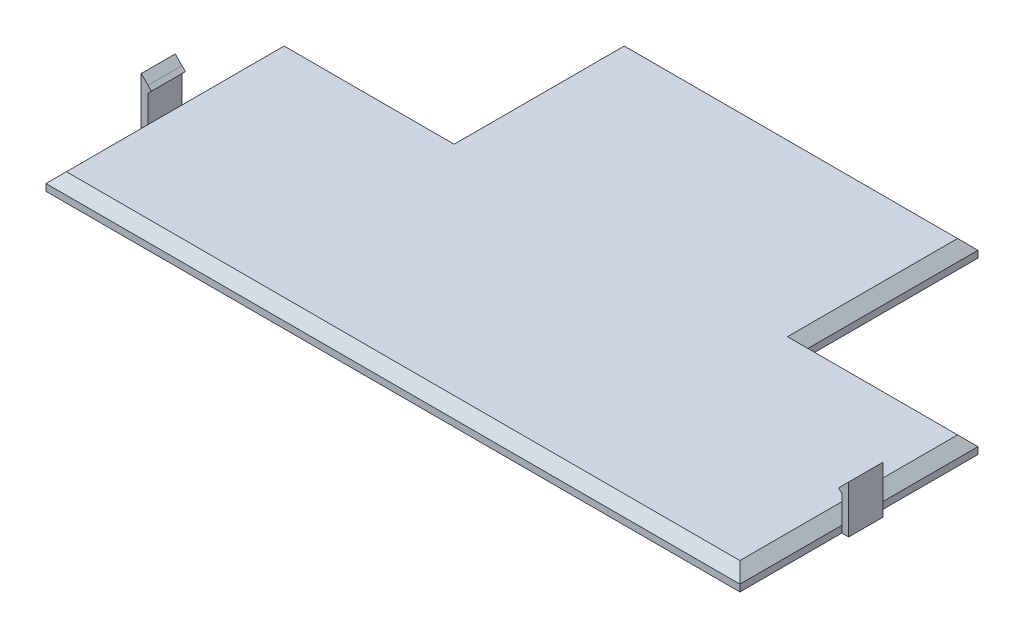
ISO-10303-21;
HEADER;
FILE_DESCRIPTION(('STEP AP214'),'2;1');
FILE_NAME('part.step','',(''),(''),'','','');
FILE_SCHEMA(('AUTOMOTIVE_DESIGN { 1 0 10303 214 1 1 1 1 }'));
ENDSEC;
DATA;
#1=APPLICATION_CONTEXT('core data for automotive mechanical design processes');
#2=APPLICATION_PROTOCOL_DEFINITION('international standard','automotive_design',2000,#1);
#3=PRODUCT_CONTEXT('',#1,'mechanical');
#4=PRODUCT('Part','Part','',(#3));
#5=PRODUCT_RELATED_PRODUCT_CATEGORY('part','',(#4));
#6=PRODUCT_DEFINITION_FORMATION('','',#4);
#7=PRODUCT_DEFINITION_CONTEXT('part definition',#1,'design');
#8=PRODUCT_DEFINITION('design','',#6,#7);
#9=PRODUCT_DEFINITION_SHAPE('','',#8);
#10=(LENGTH_UNIT() NAMED_UNIT(*) SI_UNIT(.MILLI.,.METRE.));
#11=(NAMED_UNIT(*) PLANE_ANGLE_UNIT() SI_UNIT($,.RADIAN.));
#12=(NAMED_UNIT(*) SI_UNIT($,.STERADIAN.) SOLID_ANGLE_UNIT());
#13=UNCERTAINTY_MEASURE_WITH_UNIT(LENGTH_MEASURE(1.E-05),#10,'distance_accuracy_value','');
#14=(GEOMETRIC_REPRESENTATION_CONTEXT(3) GLOBAL_UNCERTAINTY_ASSIGNED_CONTEXT((#13)) GLOBAL_UNIT_ASSIGNED_CONTEXT((#10,
#11,#12)) REPRESENTATION_CONTEXT('',''));
#15=CARTESIAN_POINT('',(0.,0.,0.));
#16=DIRECTION('',(0.,0.,1.));
#17=DIRECTION('',(1.,0.,0.));
#18=AXIS2_PLACEMENT_3D('',#15,#16,#17);
#19=CARTESIAN_POINT('',(-96.8055555555555,14.,3.47222222222221));
#20=DIRECTION('',(-1.,0.,0.));
#21=DIRECTION('',(0.,0.,1.));
#22=AXIS2_PLACEMENT_3D('',#19,#20,#21);
#23=PLANE('',#22);
#24=DIRECTION('',(0.,0.,-1.));
#25=VECTOR('',#24,1.);
#26=CARTESIAN_POINT('',(-96.8055555555555,9.99999999999997,13.4722222222222));
#27=LINE('',#26,#25);
#28=CARTESIAN_POINT('',(-96.8055555555555,9.99999999999997,13.4722222222222));
#29=VERTEX_POINT('',#28);
#30=CARTESIAN_POINT('',(-96.8055555555555,9.99999999999997,3.47222222222221));
#31=VERTEX_POINT('',#30);
#32=EDGE_CURVE('E261',#29,#31,#27,.T.);
#33=ORIENTED_EDGE('',*,*,#32,.F.);
#34=DIRECTION('',(0.,-1.,0.));
#35=VECTOR('',#34,1.);
#36=CARTESIAN_POINT('',(-96.8055555555555,14.,13.4722222222222));
#37=LINE('',#36,#35);
#38=CARTESIAN_POINT('',(-96.8055555555555,2.,13.4722222222222));
#39=VERTEX_POINT('',#38);
#40=EDGE_CURVE('E266',#29,#39,#37,.T.);
#41=ORIENTED_EDGE('',*,*,#40,.T.);
#42=DIRECTION('',(0.,0.,-1.));
#43=VECTOR('',#42,1.);
#44=CARTESIAN_POINT('',(-96.8055555555555,2.,3.47222222222221));
#45=LINE('',#44,#43);
#46=CARTESIAN_POINT('',(-96.8055555555555,2.,3.47222222222221));
#47=VERTEX_POINT('',#46);
#48=EDGE_CURVE('E263',#39,#47,#45,.T.);
#49=ORIENTED_EDGE('',*,*,#48,.T.);
#50=DIRECTION('',(0.,-1.,0.));
#51=VECTOR('',#50,1.);
#52=CARTESIAN_POINT('',(-96.8055555555555,14.,3.47222222222221));
#53=LINE('',#52,#51);
#54=EDGE_CURVE('E255',#31,#47,#53,.T.);
#55=ORIENTED_EDGE('',*,*,#54,.F.);
#56=EDGE_LOOP('',(#33,#41,#49,#55));
#57=FACE_BOUND('',#56,.T.);
#58=ADVANCED_FACE('F49',(#57),#23,.F.);
#59=CARTESIAN_POINT('',(-96.8055555555555,5.,43.4722222222222));
#60=DIRECTION('',(1.,0.,0.));
#61=DIRECTION('',(0.,0.,-1.));
#62=AXIS2_PLACEMENT_3D('',#59,#60,#61);
#63=PLANE('',#62);
#64=DIRECTION('',(0.,-1.,0.));
#65=VECTOR('',#64,1.);
#66=CARTESIAN_POINT('',(-96.8055555555555,2.,3.47222222222221));
#67=LINE('',#66,#65);
#68=CARTESIAN_POINT('',(-96.8055555555555,0.,3.47222222222221));
#69=VERTEX_POINT('',#68);
#70=EDGE_CURVE('E277',#47,#69,#67,.T.);
#71=ORIENTED_EDGE('',*,*,#70,.F.);
#72=DIRECTION('',(0.,0.,-1.));
#73=VECTOR('',#72,1.);
#74=CARTESIAN_POINT('',(-96.8055555555555,2.,43.4722222222222));
#75=LINE('',#74,#73);
#76=CARTESIAN_POINT('',(-96.8055555555555,2.,-26.5277777777778));
#77=VERTEX_POINT('',#76);
#78=EDGE_CURVE('E438',#47,#77,#75,.T.);
#79=ORIENTED_EDGE('',*,*,#78,.T.);
#80=DIRECTION('',(0.,-1.,0.));
#81=VECTOR('',#80,1.);
#82=CARTESIAN_POINT('',(-96.8055555555555,5.,-26.5277777777778));
#83=LINE('',#82,#81);
#84=CARTESIAN_POINT('',(-96.8055555555555,0.,-26.5277777777778));
#85=VERTEX_POINT('',#84);
#86=EDGE_CURVE('E383',#77,#85,#83,.T.);
#87=ORIENTED_EDGE('',*,*,#86,.T.);
#88=DIRECTION('',(0.,0.,1.));
#89=VECTOR('',#88,1.);
#90=CARTESIAN_POINT('',(-96.8055555555555,0.,43.4722222222222));
#91=LINE('',#90,#89);
#92=EDGE_CURVE('E351',#85,#69,#91,.T.);
#93=ORIENTED_EDGE('',*,*,#92,.T.);
#94=EDGE_LOOP('',(#71,#79,#87,#93));
#95=FACE_BOUND('',#94,.T.);
#96=ADVANCED_FACE('F588',(#95),#63,.F.);
#97=DIRECTION('',(0.,1.,0.));
#98=VECTOR('',#97,1.);
#99=CARTESIAN_POINT('',(-96.8055555555555,2.,13.4722222222222));
#100=LINE('',#99,#98);
#101=CARTESIAN_POINT('',(-96.8055555555555,0.,13.4722222222222));
#102=VERTEX_POINT('',#101);
#103=EDGE_CURVE('E291',#102,#39,#100,.T.);
#104=ORIENTED_EDGE('',*,*,#103,.F.);
#105=CARTESIAN_POINT('',(-96.8055555555555,0.,43.4722222222222));
#106=VERTEX_POINT('',#105);
#107=EDGE_CURVE('E355',#102,#106,#91,.T.);
#108=ORIENTED_EDGE('',*,*,#107,.T.);
#109=DIRECTION('',(0.,-1.,0.));
#110=VECTOR('',#109,1.);
#111=CARTESIAN_POINT('',(-96.8055555555555,5.,43.4722222222222));
#112=LINE('',#111,#110);
#113=CARTESIAN_POINT('',(-96.8055555555555,2.,43.4722222222222));
#114=VERTEX_POINT('',#113);
#115=EDGE_CURVE('E405',#114,#106,#112,.T.);
#116=ORIENTED_EDGE('',*,*,#115,.F.);
#117=EDGE_CURVE('E439',#114,#39,#75,.T.);
#118=ORIENTED_EDGE('',*,*,#117,.T.);
#119=EDGE_LOOP('',(#104,#108,#116,#118));
#120=FACE_BOUND('',#119,.T.);
#121=ADVANCED_FACE('F550',(#120),#63,.F.);
#122=CARTESIAN_POINT('',(107.194444444444,14.,3.47222222222221));
#123=DIRECTION('',(1.,0.,0.));
#124=DIRECTION('',(0.,0.,-1.));
#125=AXIS2_PLACEMENT_3D('',#122,#123,#124);
#126=PLANE('',#125);
#127=DIRECTION('',(0.,0.,1.));
#128=VECTOR('',#127,1.);
#129=CARTESIAN_POINT('',(107.194444444444,9.99999999999999,3.47222222222221));
#130=LINE('',#129,#128);
#131=CARTESIAN_POINT('',(107.194444444444,9.99999999999999,3.47222222222221));
#132=VERTEX_POINT('',#131);
#133=CARTESIAN_POINT('',(107.194444444444,9.99999999999999,13.4722222222222));
#134=VERTEX_POINT('',#133);
#135=EDGE_CURVE('E305',#132,#134,#130,.T.);
#136=ORIENTED_EDGE('',*,*,#135,.F.);
#137=DIRECTION('',(0.,-1.,0.));
#138=VECTOR('',#137,1.);
#139=CARTESIAN_POINT('',(107.194444444444,14.,3.47222222222221));
#140=LINE('',#139,#138);
#141=CARTESIAN_POINT('',(107.194444444444,2.,3.47222222222221));
#142=VERTEX_POINT('',#141);
#143=EDGE_CURVE('E313',#132,#142,#140,.T.);
#144=ORIENTED_EDGE('',*,*,#143,.T.);
#145=DIRECTION('',(0.,0.,1.));
#146=VECTOR('',#145,1.);
#147=CARTESIAN_POINT('',(107.194444444444,2.,13.4722222222222));
#148=LINE('',#147,#146);
#149=CARTESIAN_POINT('',(107.194444444444,2.,13.4722222222222));
#150=VERTEX_POINT('',#149);
#151=EDGE_CURVE('E325',#142,#150,#148,.T.);
#152=ORIENTED_EDGE('',*,*,#151,.T.);
#153=DIRECTION('',(0.,-1.,0.));
#154=VECTOR('',#153,1.);
#155=CARTESIAN_POINT('',(107.194444444444,14.,13.4722222222222));
#156=LINE('',#155,#154);
#157=EDGE_CURVE('E316',#134,#150,#156,.T.);
#158=ORIENTED_EDGE('',*,*,#157,.F.);
#159=EDGE_LOOP('',(#136,#144,#152,#158));
#160=FACE_BOUND('',#159,.T.);
#161=ADVANCED_FACE('F619',(#160),#126,.F.);
#162=CARTESIAN_POINT('',(107.194444444444,5.,-26.5277777777778));
#163=DIRECTION('',(-1.,0.,0.));
#164=DIRECTION('',(0.,0.,1.));
#165=AXIS2_PLACEMENT_3D('',#162,#163,#164);
#166=PLANE('',#165);
#167=DIRECTION('',(0.,-1.,0.));
#168=VECTOR('',#167,1.);
#169=CARTESIAN_POINT('',(107.194444444444,2.,13.4722222222222));
#170=LINE('',#169,#168);
#171=CARTESIAN_POINT('',(107.194444444444,0.,13.4722222222222));
#172=VERTEX_POINT('',#171);
#173=EDGE_CURVE('E319',#150,#172,#170,.T.);
#174=ORIENTED_EDGE('',*,*,#173,.F.);
#175=DIRECTION('',(0.,0.,1.));
#176=VECTOR('',#175,1.);
#177=CARTESIAN_POINT('',(107.194444444444,2.,-26.5277777777778));
#178=LINE('',#177,#176);
#179=CARTESIAN_POINT('',(107.194444444444,2.,43.4722222222222));
#180=VERTEX_POINT('',#179);
#181=EDGE_CURVE('E458',#150,#180,#178,.T.);
#182=ORIENTED_EDGE('',*,*,#181,.T.);
#183=DIRECTION('',(0.,-1.,0.));
#184=VECTOR('',#183,1.);
#185=CARTESIAN_POINT('',(107.194444444444,5.,43.4722222222222));
#186=LINE('',#185,#184);
#187=CARTESIAN_POINT('',(107.194444444444,0.,43.4722222222222));
#188=VERTEX_POINT('',#187);
#189=EDGE_CURVE('E402',#180,#188,#186,.T.);
#190=ORIENTED_EDGE('',*,*,#189,.T.);
#191=DIRECTION('',(0.,0.,-1.));
#192=VECTOR('',#191,1.);
#193=CARTESIAN_POINT('',(107.194444444444,0.,-26.5277777777778));
#194=LINE('',#193,#192);
#195=EDGE_CURVE('E360',#188,#172,#194,.T.);
#196=ORIENTED_EDGE('',*,*,#195,.T.);
#197=EDGE_LOOP('',(#174,#182,#190,#196));
#198=FACE_BOUND('',#197,.T.);
#199=ADVANCED_FACE('F560',(#198),#166,.F.);
#200=DIRECTION('',(0.,1.,0.));
#201=VECTOR('',#200,1.);
#202=CARTESIAN_POINT('',(107.194444444444,2.,3.47222222222221));
#203=LINE('',#202,#201);
#204=CARTESIAN_POINT('',(107.194444444444,0.,3.47222222222221));
#205=VERTEX_POINT('',#204);
#206=EDGE_CURVE('E336',#205,#142,#203,.T.);
#207=ORIENTED_EDGE('',*,*,#206,.F.);
#208=CARTESIAN_POINT('',(107.194444444444,0.,-26.5277777777778));
#209=VERTEX_POINT('',#208);
#210=EDGE_CURVE('E359',#205,#209,#194,.T.);
#211=ORIENTED_EDGE('',*,*,#210,.T.);
#212=DIRECTION('',(0.,-1.,0.));
#213=VECTOR('',#212,1.);
#214=CARTESIAN_POINT('',(107.194444444444,5.,-26.5277777777778));
#215=LINE('',#214,#213);
#216=CARTESIAN_POINT('',(107.194444444444,2.,-26.5277777777778));
#217=VERTEX_POINT('',#216);
#218=EDGE_CURVE('E398',#217,#209,#215,.T.);
#219=ORIENTED_EDGE('',*,*,#218,.F.);
#220=EDGE_CURVE('E459',#217,#142,#178,.T.);
#221=ORIENTED_EDGE('',*,*,#220,.T.);
#222=EDGE_LOOP('',(#207,#211,#219,#221));
#223=FACE_BOUND('',#222,.T.);
#224=ADVANCED_FACE('F614',(#223),#166,.F.);
#225=CARTESIAN_POINT('',(107.194444444444,5.,43.4722222222222));
#226=DIRECTION('',(0.,0.,-1.));
#227=DIRECTION('',(-1.,0.,0.));
#228=AXIS2_PLACEMENT_3D('',#225,#226,#227);
#229=PLANE('',#228);
#230=ORIENTED_EDGE('',*,*,#189,.F.);
#231=DIRECTION('',(-1.,0.,0.));
#232=VECTOR('',#231,1.);
#233=CARTESIAN_POINT('',(107.194444444444,2.,43.4722222222222));
#234=LINE('',#233,#232);
#235=EDGE_CURVE('E434',#180,#114,#234,.T.);
#236=ORIENTED_EDGE('',*,*,#235,.T.);
#237=ORIENTED_EDGE('',*,*,#115,.T.);
#238=DIRECTION('',(1.,0.,0.));
#239=VECTOR('',#238,1.);
#240=CARTESIAN_POINT('',(107.194444444444,0.,43.4722222222222));
#241=LINE('',#240,#239);
#242=EDGE_CURVE('E354',#106,#188,#241,.T.);
#243=ORIENTED_EDGE('',*,*,#242,.T.);
#244=EDGE_LOOP('',(#230,#236,#237,#243));
#245=FACE_BOUND('',#244,.T.);
#246=ADVANCED_FACE('F555',(#245),#229,.F.);
#247=CARTESIAN_POINT('',(57.1944444444444,5.,-26.5277777777778));
#248=DIRECTION('',(0.,0.,1.));
#249=DIRECTION('',(1.,0.,0.));
#250=AXIS2_PLACEMENT_3D('',#247,#248,#249);
#251=PLANE('',#250);
#252=DIRECTION('',(0.,-1.,0.));
#253=VECTOR('',#252,1.);
#254=CARTESIAN_POINT('',(57.1944444444444,5.,-26.5277777777778));
#255=LINE('',#254,#253);
#256=CARTESIAN_POINT('',(57.1944444444444,2.,-26.5277777777778));
#257=VERTEX_POINT('',#256);
#258=CARTESIAN_POINT('',(57.1944444444444,0.,-26.5277777777778));
#259=VERTEX_POINT('',#258);
#260=EDGE_CURVE('E395',#257,#259,#255,.T.);
#261=ORIENTED_EDGE('',*,*,#260,.F.);
#262=DIRECTION('',(1.,0.,0.));
#263=VECTOR('',#262,1.);
#264=CARTESIAN_POINT('',(57.1944444444444,2.,-26.5277777777778));
#265=LINE('',#264,#263);
#266=EDGE_CURVE('E455',#257,#217,#265,.T.);
#267=ORIENTED_EDGE('',*,*,#266,.T.);
#268=ORIENTED_EDGE('',*,*,#218,.T.);
#269=DIRECTION('',(-1.,0.,0.));
#270=VECTOR('',#269,1.);
#271=CARTESIAN_POINT('',(57.1944444444444,0.,-26.5277777777778));
#272=LINE('',#271,#270);
#273=EDGE_CURVE('E363',#209,#259,#272,.T.);
#274=ORIENTED_EDGE('',*,*,#273,.T.);
#275=EDGE_LOOP('',(#261,#267,#268,#274));
#276=FACE_BOUND('',#275,.T.);
#277=ADVANCED_FACE('F612',(#276),#251,.F.);
#278=CARTESIAN_POINT('',(57.1944444444444,5.,-76.5277777777778));
#279=DIRECTION('',(-1.,0.,0.));
#280=DIRECTION('',(0.,0.,1.));
#281=AXIS2_PLACEMENT_3D('',#278,#279,#280);
#282=PLANE('',#281);
#283=DIRECTION('',(0.,-1.,0.));
#284=VECTOR('',#283,1.);
#285=CARTESIAN_POINT('',(57.1944444444444,5.,-76.5277777777778));
#286=LINE('',#285,#284);
#287=CARTESIAN_POINT('',(57.1944444444444,2.,-76.5277777777778));
#288=VERTEX_POINT('',#287);
#289=CARTESIAN_POINT('',(57.1944444444444,0.,-76.5277777777778));
#290=VERTEX_POINT('',#289);
#291=EDGE_CURVE('E392',#288,#290,#286,.T.);
#292=ORIENTED_EDGE('',*,*,#291,.F.);
#293=DIRECTION('',(0.,0.,1.));
#294=VECTOR('',#293,1.);
#295=CARTESIAN_POINT('',(57.1944444444444,2.,-76.5277777777778));
#296=LINE('',#295,#294);
#297=EDGE_CURVE('E452',#288,#257,#296,.T.);
#298=ORIENTED_EDGE('',*,*,#297,.T.);
#299=ORIENTED_EDGE('',*,*,#260,.T.);
#300=DIRECTION('',(0.,0.,-1.));
#301=VECTOR('',#300,1.);
#302=CARTESIAN_POINT('',(57.1944444444444,0.,-76.5277777777778));
#303=LINE('',#302,#301);
#304=EDGE_CURVE('E367',#259,#290,#303,.T.);
#305=ORIENTED_EDGE('',*,*,#304,.T.);
#306=EDGE_LOOP('',(#292,#298,#299,#305));
#307=FACE_BOUND('',#306,.T.);
#308=ADVANCED_FACE('F606',(#307),#282,.F.);
#309=CARTESIAN_POINT('',(-46.8055555555555,5.,-76.5277777777778));
#310=DIRECTION('',(0.,0.,1.));
#311=DIRECTION('',(1.,0.,0.));
#312=AXIS2_PLACEMENT_3D('',#309,#310,#311);
#313=PLANE('',#312);
#314=DIRECTION('',(0.,-1.,0.));
#315=VECTOR('',#314,1.);
#316=CARTESIAN_POINT('',(-46.8055555555555,5.,-76.5277777777778));
#317=LINE('',#316,#315);
#318=CARTESIAN_POINT('',(-46.8055555555555,2.,-76.5277777777778));
#319=VERTEX_POINT('',#318);
#320=CARTESIAN_POINT('',(-46.8055555555555,0.,-76.5277777777778));
#321=VERTEX_POINT('',#320);
#322=EDGE_CURVE('E389',#319,#321,#317,.T.);
#323=ORIENTED_EDGE('',*,*,#322,.F.);
#324=DIRECTION('',(1.,0.,0.));
#325=VECTOR('',#324,1.);
#326=CARTESIAN_POINT('',(-46.8055555555555,2.,-76.5277777777778));
#327=LINE('',#326,#325);
#328=EDGE_CURVE('E449',#319,#288,#327,.T.);
#329=ORIENTED_EDGE('',*,*,#328,.T.);
#330=ORIENTED_EDGE('',*,*,#291,.T.);
#331=DIRECTION('',(-1.,0.,0.));
#332=VECTOR('',#331,1.);
#333=CARTESIAN_POINT('',(-46.8055555555555,0.,-76.5277777777778));
#334=LINE('',#333,#332);
#335=EDGE_CURVE('E371',#290,#321,#334,.T.);
#336=ORIENTED_EDGE('',*,*,#335,.T.);
#337=EDGE_LOOP('',(#323,#329,#330,#336));
#338=FACE_BOUND('',#337,.T.);
#339=ADVANCED_FACE('F603',(#338),#313,.F.);
#340=CARTESIAN_POINT('',(-46.8055555555555,5.,-26.5277777777778));
#341=DIRECTION('',(1.,0.,0.));
#342=DIRECTION('',(0.,0.,-1.));
#343=AXIS2_PLACEMENT_3D('',#340,#341,#342);
#344=PLANE('',#343);
#345=DIRECTION('',(0.,-1.,0.));
#346=VECTOR('',#345,1.);
#347=CARTESIAN_POINT('',(-46.8055555555555,5.,-26.5277777777778));
#348=LINE('',#347,#346);
#349=CARTESIAN_POINT('',(-46.8055555555555,2.,-26.5277777777778));
#350=VERTEX_POINT('',#349);
#351=CARTESIAN_POINT('',(-46.8055555555555,0.,-26.5277777777778));
#352=VERTEX_POINT('',#351);
#353=EDGE_CURVE('E386',#350,#352,#348,.T.);
#354=ORIENTED_EDGE('',*,*,#353,.F.);
#355=DIRECTION('',(0.,0.,-1.));
#356=VECTOR('',#355,1.);
#357=CARTESIAN_POINT('',(-46.8055555555555,2.,-26.5277777777778));
#358=LINE('',#357,#356);
#359=EDGE_CURVE('E446',#350,#319,#358,.T.);
#360=ORIENTED_EDGE('',*,*,#359,.T.);
#361=ORIENTED_EDGE('',*,*,#322,.T.);
#362=DIRECTION('',(0.,0.,1.));
#363=VECTOR('',#362,1.);
#364=CARTESIAN_POINT('',(-46.8055555555555,0.,-26.5277777777778));
#365=LINE('',#364,#363);
#366=EDGE_CURVE('E375',#321,#352,#365,.T.);
#367=ORIENTED_EDGE('',*,*,#366,.T.);
#368=EDGE_LOOP('',(#354,#360,#361,#367));
#369=FACE_BOUND('',#368,.T.);
#370=ADVANCED_FACE('F599',(#369),#344,.F.);
#371=CARTESIAN_POINT('',(-96.8055555555555,5.,-26.5277777777778));
#372=DIRECTION('',(0.,0.,1.));
#373=DIRECTION('',(1.,0.,0.));
#374=AXIS2_PLACEMENT_3D('',#371,#372,#373);
#375=PLANE('',#374);
#376=ORIENTED_EDGE('',*,*,#86,.F.);
#377=DIRECTION('',(1.,0.,0.));
#378=VECTOR('',#377,1.);
#379=CARTESIAN_POINT('',(-96.8055555555555,2.,-26.5277777777778));
#380=LINE('',#379,#378);
#381=EDGE_CURVE('E443',#77,#350,#380,.T.);
#382=ORIENTED_EDGE('',*,*,#381,.T.);
#383=ORIENTED_EDGE('',*,*,#353,.T.);
#384=DIRECTION('',(-1.,0.,0.));
#385=VECTOR('',#384,1.);
#386=CARTESIAN_POINT('',(-96.8055555555555,0.,-26.5277777777778));
#387=LINE('',#386,#385);
#388=EDGE_CURVE('E379',#352,#85,#387,.T.);
#389=ORIENTED_EDGE('',*,*,#388,.T.);
#390=EDGE_LOOP('',(#376,#382,#383,#389));
#391=FACE_BOUND('',#390,.T.);
#392=ADVANCED_FACE('F594',(#391),#375,.F.);
#393=CARTESIAN_POINT('',(0.,5.,0.));
#394=DIRECTION('',(0.,-1.,0.));
#395=DIRECTION('',(0.,0.,-1.));
#396=AXIS2_PLACEMENT_3D('',#393,#394,#395);
#397=PLANE('',#396);
#398=DIRECTION('',(0.,0.,1.));
#399=VECTOR('',#398,1.);
#400=CARTESIAN_POINT('',(-93.8055555555556,5.,0.));
#401=LINE('',#400,#399);
#402=CARTESIAN_POINT('',(-93.8055555555556,5.,-23.5277777777778));
#403=VERTEX_POINT('',#402);
#404=CARTESIAN_POINT('',(-93.8055555555556,5.,40.4722222222222));
#405=VERTEX_POINT('',#404);
#406=EDGE_CURVE('E427',#403,#405,#401,.T.);
#407=ORIENTED_EDGE('',*,*,#406,.T.);
#408=DIRECTION('',(1.,0.,0.));
#409=VECTOR('',#408,1.);
#410=CARTESIAN_POINT('',(0.,5.,40.4722222222222));
#411=LINE('',#410,#409);
#412=CARTESIAN_POINT('',(104.194444444444,5.,40.4722222222222));
#413=VERTEX_POINT('',#412);
#414=EDGE_CURVE('E430',#405,#413,#411,.T.);
#415=ORIENTED_EDGE('',*,*,#414,.T.);
#416=DIRECTION('',(0.,0.,-1.));
#417=VECTOR('',#416,1.);
#418=CARTESIAN_POINT('',(104.194444444444,5.,0.));
#419=LINE('',#418,#417);
#420=CARTESIAN_POINT('',(104.194444444444,5.,-23.5277777777778));
#421=VERTEX_POINT('',#420);
#422=EDGE_CURVE('E409',#413,#421,#419,.T.);
#423=ORIENTED_EDGE('',*,*,#422,.T.);
#424=DIRECTION('',(-1.,0.,0.));
#425=VECTOR('',#424,1.);
#426=CARTESIAN_POINT('',(0.,5.,-23.5277777777778));
#427=LINE('',#426,#425);
#428=CARTESIAN_POINT('',(54.1944444444445,5.,-23.5277777777778));
#429=VERTEX_POINT('',#428);
#430=EDGE_CURVE('E412',#421,#429,#427,.T.);
#431=ORIENTED_EDGE('',*,*,#430,.T.);
#432=DIRECTION('',(0.,0.,-1.));
#433=VECTOR('',#432,1.);
#434=CARTESIAN_POINT('',(54.1944444444445,5.,0.));
#435=LINE('',#434,#433);
#436=CARTESIAN_POINT('',(54.1944444444445,5.,-73.5277777777778));
#437=VERTEX_POINT('',#436);
#438=EDGE_CURVE('E415',#429,#437,#435,.T.);
#439=ORIENTED_EDGE('',*,*,#438,.T.);
#440=DIRECTION('',(-1.,0.,0.));
#441=VECTOR('',#440,1.);
#442=CARTESIAN_POINT('',(0.,5.,-73.5277777777778));
#443=LINE('',#442,#441);
#444=CARTESIAN_POINT('',(-43.8055555555556,5.,-73.5277777777778));
#445=VERTEX_POINT('',#444);
#446=EDGE_CURVE('E418',#437,#445,#443,.T.);
#447=ORIENTED_EDGE('',*,*,#446,.T.);
#448=DIRECTION('',(0.,0.,1.));
#449=VECTOR('',#448,1.);
#450=CARTESIAN_POINT('',(-43.8055555555556,5.,0.));
#451=LINE('',#450,#449);
#452=CARTESIAN_POINT('',(-43.8055555555556,5.,-23.5277777777778));
#453=VERTEX_POINT('',#452);
#454=EDGE_CURVE('E421',#445,#453,#451,.T.);
#455=ORIENTED_EDGE('',*,*,#454,.T.);
#456=DIRECTION('',(-1.,0.,0.));
#457=VECTOR('',#456,1.);
#458=CARTESIAN_POINT('',(0.,5.,-23.5277777777778));
#459=LINE('',#458,#457);
#460=EDGE_CURVE('E424',#453,#403,#459,.T.);
#461=ORIENTED_EDGE('',*,*,#460,.T.);
#462=EDGE_LOOP('',(#407,#415,#423,#431,#439,#447,#455,#461));
#463=FACE_BOUND('',#462,.T.);
#464=ADVANCED_FACE('F576',(#463),#397,.F.);
#465=CARTESIAN_POINT('',(0.,0.,0.));
#466=DIRECTION('',(0.,-1.,0.));
#467=DIRECTION('',(0.,0.,-1.));
#468=AXIS2_PLACEMENT_3D('',#465,#466,#467);
#469=PLANE('',#468);
#470=ORIENTED_EDGE('',*,*,#92,.F.);
#471=ORIENTED_EDGE('',*,*,#388,.F.);
#472=ORIENTED_EDGE('',*,*,#366,.F.);
#473=ORIENTED_EDGE('',*,*,#335,.F.);
#474=ORIENTED_EDGE('',*,*,#304,.F.);
#475=ORIENTED_EDGE('',*,*,#273,.F.);
#476=ORIENTED_EDGE('',*,*,#210,.F.);
#477=DIRECTION('',(-1.,0.,0.));
#478=VECTOR('',#477,1.);
#479=CARTESIAN_POINT('',(109.194444444444,0.,3.47222222222221));
#480=LINE('',#479,#478);
#481=CARTESIAN_POINT('',(109.194444444444,0.,3.47222222222221));
#482=VERTEX_POINT('',#481);
#483=EDGE_CURVE('E332',#482,#205,#480,.T.);
#484=ORIENTED_EDGE('',*,*,#483,.F.);
#485=DIRECTION('',(0.,0.,-1.));
#486=VECTOR('',#485,1.);
#487=CARTESIAN_POINT('',(109.194444444444,0.,13.4722222222222));
#488=LINE('',#487,#486);
#489=CARTESIAN_POINT('',(109.194444444444,0.,13.4722222222222));
#490=VERTEX_POINT('',#489);
#491=EDGE_CURVE('E324',#490,#482,#488,.T.);
#492=ORIENTED_EDGE('',*,*,#491,.F.);
#493=DIRECTION('',(-1.,0.,0.));
#494=VECTOR('',#493,1.);
#495=CARTESIAN_POINT('',(109.194444444444,0.,13.4722222222222));
#496=LINE('',#495,#494);
#497=EDGE_CURVE('E346',#490,#172,#496,.T.);
#498=ORIENTED_EDGE('',*,*,#497,.T.);
#499=ORIENTED_EDGE('',*,*,#195,.F.);
#500=ORIENTED_EDGE('',*,*,#242,.F.);
#501=ORIENTED_EDGE('',*,*,#107,.F.);
#502=DIRECTION('',(1.,0.,0.));
#503=VECTOR('',#502,1.);
#504=CARTESIAN_POINT('',(-98.8055555555555,0.,13.4722222222222));
#505=LINE('',#504,#503);
#506=CARTESIAN_POINT('',(-98.8055555555555,0.,13.4722222222222));
#507=VERTEX_POINT('',#506);
#508=EDGE_CURVE('E288',#507,#102,#505,.T.);
#509=ORIENTED_EDGE('',*,*,#508,.F.);
#510=DIRECTION('',(0.,0.,1.));
#511=VECTOR('',#510,1.);
#512=CARTESIAN_POINT('',(-98.8055555555555,0.,3.47222222222221));
#513=LINE('',#512,#511);
#514=CARTESIAN_POINT('',(-98.8055555555555,0.,3.47222222222221));
#515=VERTEX_POINT('',#514);
#516=EDGE_CURVE('E282',#515,#507,#513,.T.);
#517=ORIENTED_EDGE('',*,*,#516,.F.);
#518=DIRECTION('',(1.,0.,0.));
#519=VECTOR('',#518,1.);
#520=CARTESIAN_POINT('',(-98.8055555555555,0.,3.47222222222221));
#521=LINE('',#520,#519);
#522=EDGE_CURVE('E300',#515,#69,#521,.T.);
#523=ORIENTED_EDGE('',*,*,#522,.T.);
#524=EDGE_LOOP('',(#470,#471,#472,#473,#474,#475,#476,#484,#492,#498,#499,#500,#501,#509,#517,#523));
#525=FACE_BOUND('',#524,.T.);
#526=ADVANCED_FACE('F540',(#525),#469,.T.);
#527=CARTESIAN_POINT('',(0.,5.,-73.5277777777778));
#528=DIRECTION('',(0.,-0.707106781186544,0.707106781186551));
#529=DIRECTION('',(-1.,0.,0.));
#530=AXIS2_PLACEMENT_3D('',#527,#528,#529);
#531=PLANE('',#530);
#532=DIRECTION('',(-0.577350269189624,0.577350269189629,0.577350269189624));
#533=VECTOR('',#532,1.);
#534=CARTESIAN_POINT('',(29.6851851851854,29.5092592592593,-49.0185185185187));
#535=LINE('',#534,#533);
#536=EDGE_CURVE('E485',#288,#437,#535,.T.);
#537=ORIENTED_EDGE('',*,*,#536,.F.);
#538=ORIENTED_EDGE('',*,*,#328,.F.);
#539=DIRECTION('',(0.577350269189624,0.577350269189629,0.577350269189624));
#540=VECTOR('',#539,1.);
#541=CARTESIAN_POINT('',(-29.2037037037038,19.6018518518519,-58.9259259259261));
#542=LINE('',#541,#540);
#543=EDGE_CURVE('E489',#445,#319,#542,.F.);
#544=ORIENTED_EDGE('',*,*,#543,.F.);
#545=ORIENTED_EDGE('',*,*,#446,.F.);
#546=EDGE_LOOP('',(#537,#538,#544,#545));
#547=FACE_BOUND('',#546,.T.);
#548=ADVANCED_FACE('F664',(#547),#531,.F.);
#549=CARTESIAN_POINT('',(-43.8055555555556,5.,0.));
#550=DIRECTION('',(0.707106781186551,-0.707106781186544,0.));
#551=DIRECTION('',(0.,0.,1.));
#552=AXIS2_PLACEMENT_3D('',#549,#550,#551);
#553=PLANE('',#552);
#554=ORIENTED_EDGE('',*,*,#543,.T.);
#555=ORIENTED_EDGE('',*,*,#359,.F.);
#556=DIRECTION('',(0.577350269189624,0.577350269189629,0.577350269189624));
#557=VECTOR('',#556,1.);
#558=CARTESIAN_POINT('',(-29.2037037037038,19.6018518518519,-8.92592592592605));
#559=LINE('',#558,#557);
#560=EDGE_CURVE('E481',#453,#350,#559,.F.);
#561=ORIENTED_EDGE('',*,*,#560,.F.);
#562=ORIENTED_EDGE('',*,*,#454,.F.);
#563=EDGE_LOOP('',(#554,#555,#561,#562));
#564=FACE_BOUND('',#563,.T.);
#565=ADVANCED_FACE('F846',(#564),#553,.F.);
#566=CARTESIAN_POINT('',(54.1944444444445,5.,0.));
#567=DIRECTION('',(-0.707106781186551,-0.707106781186544,0.));
#568=DIRECTION('',(0.,0.,-1.));
#569=AXIS2_PLACEMENT_3D('',#566,#567,#568);
#570=PLANE('',#569);
#571=ORIENTED_EDGE('',*,*,#536,.T.);
#572=ORIENTED_EDGE('',*,*,#438,.F.);
#573=DIRECTION('',(-0.577350269189624,0.577350269189629,0.577350269189624));
#574=VECTOR('',#573,1.);
#575=CARTESIAN_POINT('',(46.3518518518519,12.8425925925926,-15.6851851851853));
#576=LINE('',#575,#574);
#577=EDGE_CURVE('E477',#257,#429,#576,.T.);
#578=ORIENTED_EDGE('',*,*,#577,.F.);
#579=ORIENTED_EDGE('',*,*,#297,.F.);
#580=EDGE_LOOP('',(#571,#572,#578,#579));
#581=FACE_BOUND('',#580,.T.);
#582=ADVANCED_FACE('F836',(#581),#570,.F.);
#583=CARTESIAN_POINT('',(0.,5.,-23.5277777777778));
#584=DIRECTION('',(0.,-0.707106781186544,0.707106781186551));
#585=DIRECTION('',(-1.,0.,0.));
#586=AXIS2_PLACEMENT_3D('',#583,#584,#585);
#587=PLANE('',#586);
#588=ORIENTED_EDGE('',*,*,#560,.T.);
#589=ORIENTED_EDGE('',*,*,#381,.F.);
#590=DIRECTION('',(0.577350269189624,0.577350269189629,0.577350269189624));
#591=VECTOR('',#590,1.);
#592=CARTESIAN_POINT('',(-62.5370370370372,36.2685185185186,7.74074074074052));
#593=LINE('',#592,#591);
#594=EDGE_CURVE('E473',#403,#77,#593,.F.);
#595=ORIENTED_EDGE('',*,*,#594,.F.);
#596=ORIENTED_EDGE('',*,*,#460,.F.);
#597=EDGE_LOOP('',(#588,#589,#595,#596));
#598=FACE_BOUND('',#597,.T.);
#599=ADVANCED_FACE('F827',(#598),#587,.F.);
#600=CARTESIAN_POINT('',(0.,5.,-23.5277777777778));
#601=DIRECTION('',(0.,-0.707106781186544,0.707106781186551));
#602=DIRECTION('',(-1.,0.,0.));
#603=AXIS2_PLACEMENT_3D('',#600,#601,#602);
#604=PLANE('',#603);
#605=ORIENTED_EDGE('',*,*,#577,.T.);
#606=ORIENTED_EDGE('',*,*,#430,.F.);
#607=DIRECTION('',(-0.577350269189623,0.57735026918963,0.577350269189624));
#608=VECTOR('',#607,1.);
#609=CARTESIAN_POINT('',(96.3518518518519,12.8425925925926,-15.6851851851853));
#610=LINE('',#609,#608);
#611=EDGE_CURVE('E469',#217,#421,#610,.T.);
#612=ORIENTED_EDGE('',*,*,#611,.F.);
#613=ORIENTED_EDGE('',*,*,#266,.F.);
#614=EDGE_LOOP('',(#605,#606,#612,#613));
#615=FACE_BOUND('',#614,.T.);
#616=ADVANCED_FACE('F616',(#615),#604,.F.);
#617=CARTESIAN_POINT('',(-93.8055555555556,5.,0.));
#618=DIRECTION('',(0.707106781186551,-0.707106781186544,0.));
#619=DIRECTION('',(0.,0.,1.));
#620=AXIS2_PLACEMENT_3D('',#617,#618,#619);
#621=PLANE('',#620);
#622=ORIENTED_EDGE('',*,*,#594,.T.);
#623=ORIENTED_EDGE('',*,*,#78,.F.);
#624=ORIENTED_EDGE('',*,*,#48,.F.);
#625=ORIENTED_EDGE('',*,*,#117,.F.);
#626=DIRECTION('',(0.577350269189624,0.577350269189629,-0.577350269189624));
#627=VECTOR('',#626,1.);
#628=CARTESIAN_POINT('',(-80.3148148148149,18.4907407407408,26.9814814814816));
#629=LINE('',#628,#627);
#630=EDGE_CURVE('E466',#405,#114,#629,.F.);
#631=ORIENTED_EDGE('',*,*,#630,.F.);
#632=ORIENTED_EDGE('',*,*,#406,.F.);
#633=EDGE_LOOP('',(#622,#623,#624,#625,#631,#632));
#634=FACE_BOUND('',#633,.T.);
#635=ADVANCED_FACE('F581',(#634),#621,.F.);
#636=CARTESIAN_POINT('',(104.194444444444,5.,0.));
#637=DIRECTION('',(-0.707106781186551,-0.707106781186544,0.));
#638=DIRECTION('',(0.,0.,-1.));
#639=AXIS2_PLACEMENT_3D('',#636,#637,#638);
#640=PLANE('',#639);
#641=ORIENTED_EDGE('',*,*,#611,.T.);
#642=ORIENTED_EDGE('',*,*,#422,.F.);
#643=DIRECTION('',(0.577350269189624,-0.577350269189629,0.577350269189624));
#644=VECTOR('',#643,1.);
#645=CARTESIAN_POINT('',(90.7037037037038,18.4907407407408,26.9814814814815));
#646=LINE('',#645,#644);
#647=EDGE_CURVE('E350',#180,#413,#646,.F.);
#648=ORIENTED_EDGE('',*,*,#647,.F.);
#649=ORIENTED_EDGE('',*,*,#181,.F.);
#650=ORIENTED_EDGE('',*,*,#151,.F.);
#651=ORIENTED_EDGE('',*,*,#220,.F.);
#652=EDGE_LOOP('',(#641,#642,#648,#649,#650,#651));
#653=FACE_BOUND('',#652,.T.);
#654=ADVANCED_FACE('F570',(#653),#640,.F.);
#655=CARTESIAN_POINT('',(0.,5.,40.4722222222222));
#656=DIRECTION('',(0.,-0.707106781186544,-0.707106781186551));
#657=DIRECTION('',(1.,0.,0.));
#658=AXIS2_PLACEMENT_3D('',#655,#656,#657);
#659=PLANE('',#658);
#660=ORIENTED_EDGE('',*,*,#630,.T.);
#661=ORIENTED_EDGE('',*,*,#235,.F.);
#662=ORIENTED_EDGE('',*,*,#647,.T.);
#663=ORIENTED_EDGE('',*,*,#414,.F.);
#664=EDGE_LOOP('',(#660,#661,#662,#663));
#665=FACE_BOUND('',#664,.T.);
#666=ADVANCED_FACE('F564',(#665),#659,.F.);
#667=CARTESIAN_POINT('',(109.194444444444,2.,13.4722222222222));
#668=DIRECTION('',(0.,0.,-1.));
#669=DIRECTION('',(0.,1.,0.));
#670=AXIS2_PLACEMENT_3D('',#667,#668,#669);
#671=PLANE('',#670);
#672=DIRECTION('',(-0.707106781186548,-0.707106781186548,0.));
#673=VECTOR('',#672,1.);
#674=CARTESIAN_POINT('',(106.194444444444,11.,13.4722222222222));
#675=LINE('',#674,#673);
#676=CARTESIAN_POINT('',(107.194444444444,12.,13.4722222222222));
#677=VERTEX_POINT('',#676);
#678=CARTESIAN_POINT('',(106.194444444444,11.,13.4722222222222));
#679=VERTEX_POINT('',#678);
#680=EDGE_CURVE('E502',#677,#679,#675,.T.);
#681=ORIENTED_EDGE('',*,*,#680,.T.);
#682=DIRECTION('',(0.707106781186548,-0.707106781186548,0.));
#683=VECTOR('',#682,1.);
#684=CARTESIAN_POINT('',(106.194444444444,11.,13.4722222222222));
#685=LINE('',#684,#683);
#686=EDGE_CURVE('E505',#679,#134,#685,.T.);
#687=ORIENTED_EDGE('',*,*,#686,.T.);
#688=ORIENTED_EDGE('',*,*,#157,.T.);
#689=ORIENTED_EDGE('',*,*,#173,.T.);
#690=ORIENTED_EDGE('',*,*,#497,.F.);
#691=DIRECTION('',(0.,-1.,0.));
#692=VECTOR('',#691,1.);
#693=CARTESIAN_POINT('',(109.194444444444,2.,13.4722222222222));
#694=LINE('',#693,#692);
#695=CARTESIAN_POINT('',(109.194444444444,14.,13.4722222222222));
#696=VERTEX_POINT('',#695);
#697=EDGE_CURVE('E320',#696,#490,#694,.T.);
#698=ORIENTED_EDGE('',*,*,#697,.F.);
#699=DIRECTION('',(-0.707106781186543,-0.707106781186552,0.));
#700=VECTOR('',#699,1.);
#701=CARTESIAN_POINT('',(109.194444444444,14.,13.4722222222222));
#702=LINE('',#701,#700);
#703=EDGE_CURVE('E463',#696,#677,#702,.T.);
#704=ORIENTED_EDGE('',*,*,#703,.T.);
#705=EDGE_LOOP('',(#681,#687,#688,#689,#690,#698,#704));
#706=FACE_BOUND('',#705,.T.);
#707=ADVANCED_FACE('F621',(#706),#671,.F.);
#708=CARTESIAN_POINT('',(109.194444444444,2.,3.47222222222221));
#709=DIRECTION('',(0.,0.,1.));
#710=DIRECTION('',(1.,0.,0.));
#711=AXIS2_PLACEMENT_3D('',#708,#709,#710);
#712=PLANE('',#711);
#713=ORIENTED_EDGE('',*,*,#143,.F.);
#714=DIRECTION('',(-0.707106781186548,0.707106781186548,0.));
#715=VECTOR('',#714,1.);
#716=CARTESIAN_POINT('',(106.194444444444,11.,3.47222222222221));
#717=LINE('',#716,#715);
#718=CARTESIAN_POINT('',(106.194444444444,11.,3.47222222222221));
#719=VERTEX_POINT('',#718);
#720=EDGE_CURVE('E244',#132,#719,#717,.T.);
#721=ORIENTED_EDGE('',*,*,#720,.T.);
#722=DIRECTION('',(0.707106781186548,0.707106781186548,0.));
#723=VECTOR('',#722,1.);
#724=CARTESIAN_POINT('',(106.194444444444,11.,3.47222222222221));
#725=LINE('',#724,#723);
#726=CARTESIAN_POINT('',(107.194444444444,12.,3.47222222222221));
#727=VERTEX_POINT('',#726);
#728=EDGE_CURVE('E508',#719,#727,#725,.T.);
#729=ORIENTED_EDGE('',*,*,#728,.T.);
#730=DIRECTION('',(0.707106781186543,0.707106781186552,0.));
#731=VECTOR('',#730,1.);
#732=CARTESIAN_POINT('',(109.194444444444,14.,3.47222222222221));
#733=LINE('',#732,#731);
#734=CARTESIAN_POINT('',(109.194444444444,14.,3.47222222222221));
#735=VERTEX_POINT('',#734);
#736=EDGE_CURVE('E499',#727,#735,#733,.T.);
#737=ORIENTED_EDGE('',*,*,#736,.T.);
#738=DIRECTION('',(0.,1.,0.));
#739=VECTOR('',#738,1.);
#740=CARTESIAN_POINT('',(109.194444444444,2.,3.47222222222221));
#741=LINE('',#740,#739);
#742=EDGE_CURVE('E328',#482,#735,#741,.T.);
#743=ORIENTED_EDGE('',*,*,#742,.F.);
#744=ORIENTED_EDGE('',*,*,#483,.T.);
#745=ORIENTED_EDGE('',*,*,#206,.T.);
#746=EDGE_LOOP('',(#713,#721,#729,#737,#743,#744,#745));
#747=FACE_BOUND('',#746,.T.);
#748=ADVANCED_FACE('F527',(#747),#712,.F.);
#749=CARTESIAN_POINT('',(109.194444444444,0.,0.));
#750=DIRECTION('',(1.,0.,0.));
#751=DIRECTION('',(0.,0.,-1.));
#752=AXIS2_PLACEMENT_3D('',#749,#750,#751);
#753=PLANE('',#752);
#754=ORIENTED_EDGE('',*,*,#697,.T.);
#755=ORIENTED_EDGE('',*,*,#491,.T.);
#756=ORIENTED_EDGE('',*,*,#742,.T.);
#757=DIRECTION('',(0.,0.,-1.));
#758=VECTOR('',#757,1.);
#759=CARTESIAN_POINT('',(109.194444444444,14.,3.47222222222221));
#760=LINE('',#759,#758);
#761=EDGE_CURVE('E309',#696,#735,#760,.T.);
#762=ORIENTED_EDGE('',*,*,#761,.F.);
#763=EDGE_LOOP('',(#754,#755,#756,#762));
#764=FACE_BOUND('',#763,.T.);
#765=ADVANCED_FACE('F534',(#764),#753,.T.);
#766=CARTESIAN_POINT('',(109.194444444444,14.,0.));
#767=DIRECTION('',(-0.707106781186552,0.707106781186543,0.));
#768=DIRECTION('',(0.,0.,-1.));
#769=AXIS2_PLACEMENT_3D('',#766,#767,#768);
#770=PLANE('',#769);
#771=ORIENTED_EDGE('',*,*,#736,.F.);
#772=DIRECTION('',(0.,0.,-1.));
#773=VECTOR('',#772,1.);
#774=CARTESIAN_POINT('',(107.194444444444,12.,3.47222222222221));
#775=LINE('',#774,#773);
#776=EDGE_CURVE('E495',#677,#727,#775,.T.);
#777=ORIENTED_EDGE('',*,*,#776,.F.);
#778=ORIENTED_EDGE('',*,*,#703,.F.);
#779=ORIENTED_EDGE('',*,*,#761,.T.);
#780=EDGE_LOOP('',(#771,#777,#778,#779));
#781=FACE_BOUND('',#780,.T.);
#782=ADVANCED_FACE('F530',(#781),#770,.T.);
#783=CARTESIAN_POINT('',(106.194444444444,11.,0.));
#784=DIRECTION('',(-0.707106781186547,0.707106781186547,0.));
#785=DIRECTION('',(0.,0.,1.));
#786=AXIS2_PLACEMENT_3D('',#783,#784,#785);
#787=PLANE('',#786);
#788=ORIENTED_EDGE('',*,*,#776,.T.);
#789=ORIENTED_EDGE('',*,*,#728,.F.);
#790=DIRECTION('',(0.,0.,-1.));
#791=VECTOR('',#790,1.);
#792=CARTESIAN_POINT('',(106.194444444444,11.,3.47222222222221));
#793=LINE('',#792,#791);
#794=EDGE_CURVE('E304',#679,#719,#793,.T.);
#795=ORIENTED_EDGE('',*,*,#794,.F.);
#796=ORIENTED_EDGE('',*,*,#680,.F.);
#797=EDGE_LOOP('',(#788,#789,#795,#796));
#798=FACE_BOUND('',#797,.T.);
#799=ADVANCED_FACE('F522',(#798),#787,.T.);
#800=CARTESIAN_POINT('',(106.194444444444,11.,0.));
#801=DIRECTION('',(-0.707106781186548,-0.707106781186548,0.));
#802=DIRECTION('',(0.,0.,-1.));
#803=AXIS2_PLACEMENT_3D('',#800,#801,#802);
#804=PLANE('',#803);
#805=ORIENTED_EDGE('',*,*,#720,.F.);
#806=ORIENTED_EDGE('',*,*,#135,.T.);
#807=ORIENTED_EDGE('',*,*,#686,.F.);
#808=ORIENTED_EDGE('',*,*,#794,.T.);
#809=EDGE_LOOP('',(#805,#806,#807,#808));
#810=FACE_BOUND('',#809,.T.);
#811=ADVANCED_FACE('F517',(#810),#804,.T.);
#812=CARTESIAN_POINT('',(-98.8055555555555,2.,3.47222222222221));
#813=DIRECTION('',(0.,0.,1.));
#814=DIRECTION('',(1.,0.,0.));
#815=AXIS2_PLACEMENT_3D('',#812,#813,#814);
#816=PLANE('',#815);
#817=DIRECTION('',(0.707106781186538,-0.707106781186557,0.));
#818=VECTOR('',#817,1.);
#819=CARTESIAN_POINT('',(-95.8055555555555,10.9999999999999,3.47222222222221));
#820=LINE('',#819,#818);
#821=CARTESIAN_POINT('',(-96.8055555555555,12.,3.47222222222221));
#822=VERTEX_POINT('',#821);
#823=CARTESIAN_POINT('',(-95.8055555555555,10.9999999999999,3.47222222222221));
#824=VERTEX_POINT('',#823);
#825=EDGE_CURVE('E73',#822,#824,#820,.T.);
#826=ORIENTED_EDGE('',*,*,#825,.T.);
#827=DIRECTION('',(-0.707106781186538,-0.707106781186557,0.));
#828=VECTOR('',#827,1.);
#829=CARTESIAN_POINT('',(-95.8055555555555,11.,3.47222222222221));
#830=LINE('',#829,#828);
#831=EDGE_CURVE('E229',#824,#31,#830,.T.);
#832=ORIENTED_EDGE('',*,*,#831,.T.);
#833=ORIENTED_EDGE('',*,*,#54,.T.);
#834=ORIENTED_EDGE('',*,*,#70,.T.);
#835=ORIENTED_EDGE('',*,*,#522,.F.);
#836=DIRECTION('',(0.,-1.,0.));
#837=VECTOR('',#836,1.);
#838=CARTESIAN_POINT('',(-98.8055555555555,2.,3.47222222222221));
#839=LINE('',#838,#837);
#840=CARTESIAN_POINT('',(-98.8055555555555,14.,3.47222222222221));
#841=VERTEX_POINT('',#840);
#842=EDGE_CURVE('E278',#841,#515,#839,.T.);
#843=ORIENTED_EDGE('',*,*,#842,.F.);
#844=DIRECTION('',(0.707106781186543,-0.707106781186552,0.));
#845=VECTOR('',#844,1.);
#846=CARTESIAN_POINT('',(-98.8055555555555,14.,3.47222222222221));
#847=LINE('',#846,#845);
#848=EDGE_CURVE('E241',#841,#822,#847,.T.);
#849=ORIENTED_EDGE('',*,*,#848,.T.);
#850=EDGE_LOOP('',(#826,#832,#833,#834,#835,#843,#849));
#851=FACE_BOUND('',#850,.T.);
#852=ADVANCED_FACE('F253',(#851),#816,.F.);
#853=CARTESIAN_POINT('',(-98.8055555555555,2.,13.4722222222222));
#854=DIRECTION('',(0.,0.,-1.));
#855=DIRECTION('',(-1.,0.,0.));
#856=AXIS2_PLACEMENT_3D('',#853,#854,#855);
#857=PLANE('',#856);
#858=ORIENTED_EDGE('',*,*,#40,.F.);
#859=DIRECTION('',(0.707106781186538,0.707106781186557,0.));
#860=VECTOR('',#859,1.);
#861=CARTESIAN_POINT('',(-95.8055555555555,11.,13.4722222222222));
#862=LINE('',#861,#860);
#863=CARTESIAN_POINT('',(-95.8055555555555,10.9999999999999,13.4722222222222));
#864=VERTEX_POINT('',#863);
#865=EDGE_CURVE('E11',#29,#864,#862,.T.);
#866=ORIENTED_EDGE('',*,*,#865,.T.);
#867=DIRECTION('',(-0.707106781186538,0.707106781186557,0.));
#868=VECTOR('',#867,1.);
#869=CARTESIAN_POINT('',(-95.8055555555555,10.9999999999999,13.4722222222222));
#870=LINE('',#869,#868);
#871=CARTESIAN_POINT('',(-96.8055555555555,12.,13.4722222222222));
#872=VERTEX_POINT('',#871);
#873=EDGE_CURVE('E60',#864,#872,#870,.T.);
#874=ORIENTED_EDGE('',*,*,#873,.T.);
#875=DIRECTION('',(-0.707106781186543,0.707106781186552,0.));
#876=VECTOR('',#875,1.);
#877=CARTESIAN_POINT('',(-98.8055555555555,14.,13.4722222222222));
#878=LINE('',#877,#876);
#879=CARTESIAN_POINT('',(-98.8055555555555,14.,13.4722222222222));
#880=VERTEX_POINT('',#879);
#881=EDGE_CURVE('E223',#872,#880,#878,.T.);
#882=ORIENTED_EDGE('',*,*,#881,.T.);
#883=DIRECTION('',(0.,1.,0.));
#884=VECTOR('',#883,1.);
#885=CARTESIAN_POINT('',(-98.8055555555555,2.,13.4722222222222));
#886=LINE('',#885,#884);
#887=EDGE_CURVE('E285',#507,#880,#886,.T.);
#888=ORIENTED_EDGE('',*,*,#887,.F.);
#889=ORIENTED_EDGE('',*,*,#508,.T.);
#890=ORIENTED_EDGE('',*,*,#103,.T.);
#891=EDGE_LOOP('',(#858,#866,#874,#882,#888,#889,#890));
#892=FACE_BOUND('',#891,.T.);
#893=ADVANCED_FACE('F221',(#892),#857,.F.);
#894=CARTESIAN_POINT('',(-98.8055555555555,0.,0.));
#895=DIRECTION('',(-1.,0.,0.));
#896=DIRECTION('',(0.,0.,1.));
#897=AXIS2_PLACEMENT_3D('',#894,#895,#896);
#898=PLANE('',#897);
#899=ORIENTED_EDGE('',*,*,#842,.T.);
#900=ORIENTED_EDGE('',*,*,#516,.T.);
#901=ORIENTED_EDGE('',*,*,#887,.T.);
#902=DIRECTION('',(0.,0.,1.));
#903=VECTOR('',#902,1.);
#904=CARTESIAN_POINT('',(-98.8055555555555,14.,3.47222222222221));
#905=LINE('',#904,#903);
#906=EDGE_CURVE('E237',#841,#880,#905,.T.);
#907=ORIENTED_EDGE('',*,*,#906,.F.);
#908=EDGE_LOOP('',(#899,#900,#901,#907));
#909=FACE_BOUND('',#908,.T.);
#910=ADVANCED_FACE('F586',(#909),#898,.T.);
#911=CARTESIAN_POINT('',(-98.8055555555555,14.,0.));
#912=DIRECTION('',(0.707106781186552,0.707106781186542,0.));
#913=DIRECTION('',(0.,0.,1.));
#914=AXIS2_PLACEMENT_3D('',#911,#912,#913);
#915=PLANE('',#914);
#916=ORIENTED_EDGE('',*,*,#881,.F.);
#917=DIRECTION('',(0.,0.,1.));
#918=VECTOR('',#917,1.);
#919=CARTESIAN_POINT('',(-96.8055555555555,12.,13.4722222222222));
#920=LINE('',#919,#918);
#921=EDGE_CURVE('E235',#822,#872,#920,.T.);
#922=ORIENTED_EDGE('',*,*,#921,.F.);
#923=ORIENTED_EDGE('',*,*,#848,.F.);
#924=ORIENTED_EDGE('',*,*,#906,.T.);
#925=EDGE_LOOP('',(#916,#922,#923,#924));
#926=FACE_BOUND('',#925,.T.);
#927=ADVANCED_FACE('F234',(#926),#915,.T.);
#928=CARTESIAN_POINT('',(-95.8055555555555,10.9999999999999,0.));
#929=DIRECTION('',(0.707106781186557,0.707106781186538,0.));
#930=DIRECTION('',(0.,0.,-1.));
#931=AXIS2_PLACEMENT_3D('',#928,#929,#930);
#932=PLANE('',#931);
#933=ORIENTED_EDGE('',*,*,#921,.T.);
#934=ORIENTED_EDGE('',*,*,#873,.F.);
#935=DIRECTION('',(0.,0.,1.));
#936=VECTOR('',#935,1.);
#937=CARTESIAN_POINT('',(-95.8055555555555,10.9999999999999,13.4722222222222));
#938=LINE('',#937,#936);
#939=EDGE_CURVE('E54',#824,#864,#938,.T.);
#940=ORIENTED_EDGE('',*,*,#939,.F.);
#941=ORIENTED_EDGE('',*,*,#825,.F.);
#942=EDGE_LOOP('',(#933,#934,#940,#941));
#943=FACE_BOUND('',#942,.T.);
#944=ADVANCED_FACE('F52',(#943),#932,.T.);
#945=CARTESIAN_POINT('',(-95.8055555555555,11.,0.));
#946=DIRECTION('',(0.707106781186557,-0.707106781186538,0.));
#947=DIRECTION('',(0.,0.,1.));
#948=AXIS2_PLACEMENT_3D('',#945,#946,#947);
#949=PLANE('',#948);
#950=ORIENTED_EDGE('',*,*,#865,.F.);
#951=ORIENTED_EDGE('',*,*,#32,.T.);
#952=ORIENTED_EDGE('',*,*,#831,.F.);
#953=ORIENTED_EDGE('',*,*,#939,.T.);
#954=EDGE_LOOP('',(#950,#951,#952,#953));
#955=FACE_BOUND('',#954,.T.);
#956=ADVANCED_FACE('F268',(#955),#949,.T.);
#957=CLOSED_SHELL('',(#58,#96,#121,#161,#199,#224,#246,#277,#308,#339,#370,#392,#464,#526,#548,
#565,#582,#599,#616,#635,#654,#666,#707,#748,#765,#782,#799,#811,#852,#893,#910,#927,#944,#956));
#958=MANIFOLD_SOLID_BREP('B2',#957);
#959=ADVANCED_BREP_SHAPE_REPRESENTATION('',(#18,#958),#14);
#960=SHAPE_DEFINITION_REPRESENTATION(#9,#959);
ENDSEC;
END-ISO-10303-21;
